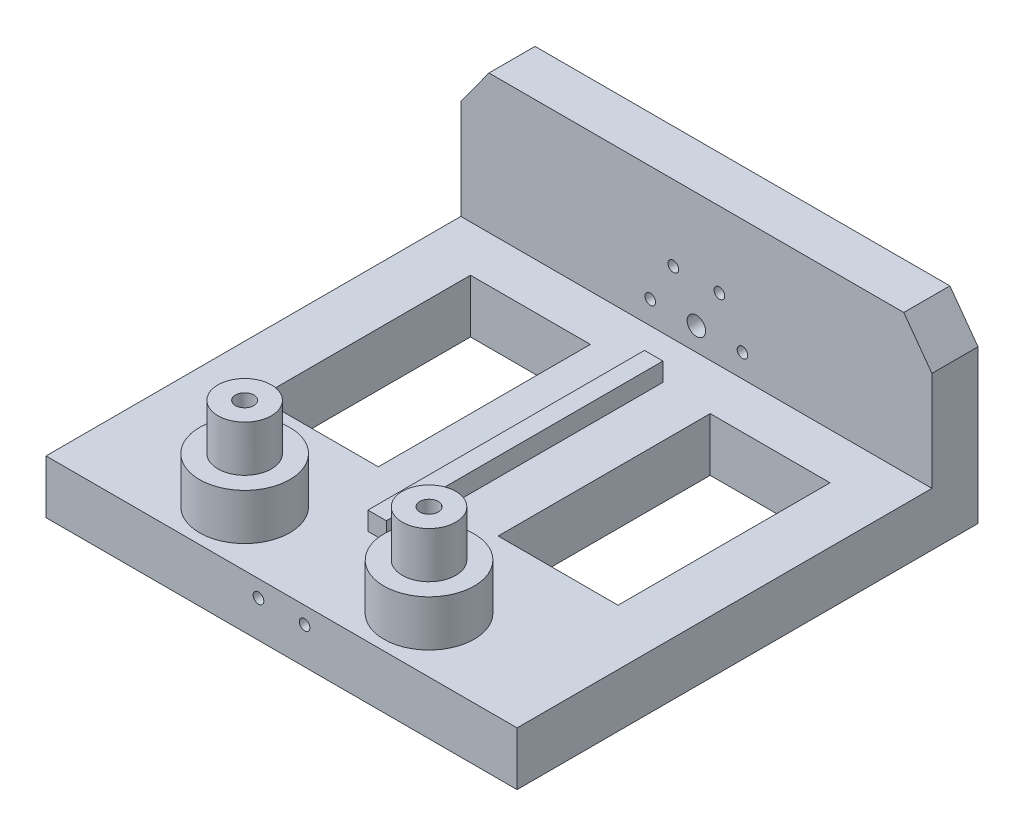
ISO-10303-21;
HEADER;
FILE_DESCRIPTION(('STEP AP214'),'2;1');
FILE_NAME('part.step','',(''),(''),'','','');
FILE_SCHEMA(('AUTOMOTIVE_DESIGN { 1 0 10303 214 1 1 1 1 }'));
ENDSEC;
DATA;
#1=APPLICATION_CONTEXT('core data for automotive mechanical design processes');
#2=APPLICATION_PROTOCOL_DEFINITION('international standard','automotive_design',2000,#1);
#3=PRODUCT_CONTEXT('',#1,'mechanical');
#4=PRODUCT('Part','Part','',(#3));
#5=PRODUCT_RELATED_PRODUCT_CATEGORY('part','',(#4));
#6=PRODUCT_DEFINITION_FORMATION('','',#4);
#7=PRODUCT_DEFINITION_CONTEXT('part definition',#1,'design');
#8=PRODUCT_DEFINITION('design','',#6,#7);
#9=PRODUCT_DEFINITION_SHAPE('','',#8);
#10=(LENGTH_UNIT() NAMED_UNIT(*) SI_UNIT(.MILLI.,.METRE.));
#11=(NAMED_UNIT(*) PLANE_ANGLE_UNIT() SI_UNIT($,.RADIAN.));
#12=(NAMED_UNIT(*) SI_UNIT($,.STERADIAN.) SOLID_ANGLE_UNIT());
#13=UNCERTAINTY_MEASURE_WITH_UNIT(LENGTH_MEASURE(1.E-05),#10,'distance_accuracy_value','');
#14=(GEOMETRIC_REPRESENTATION_CONTEXT(3) GLOBAL_UNCERTAINTY_ASSIGNED_CONTEXT((#13)) GLOBAL_UNIT_ASSIGNED_CONTEXT((#10,
#11,#12)) REPRESENTATION_CONTEXT('',''));
#15=CARTESIAN_POINT('',(0.,0.,0.));
#16=DIRECTION('',(0.,0.,1.));
#17=DIRECTION('',(1.,0.,0.));
#18=AXIS2_PLACEMENT_3D('',#15,#16,#17);
#19=CARTESIAN_POINT('',(0.,-2.5,50.));
#20=DIRECTION('',(0.,1.,0.));
#21=DIRECTION('',(0.,0.,1.));
#22=AXIS2_PLACEMENT_3D('',#19,#20,#21);
#23=PLANE('',#22);
#24=CARTESIAN_POINT('',(-9.99999999999999,-2.5,44.));
#25=DIRECTION('',(0.,1.,0.));
#26=DIRECTION('',(0.,0.,1.));
#27=AXIS2_PLACEMENT_3D('',#24,#25,#26);
#28=CIRCLE('',#27,4.9);
#29=CARTESIAN_POINT('',(-9.99999999999999,-2.5,48.9));
#30=VERTEX_POINT('',#29);
#31=EDGE_CURVE('E234',#30,#30,#28,.T.);
#32=ORIENTED_EDGE('',*,*,#31,.F.);
#33=EDGE_LOOP('',(#32));
#34=FACE_BOUND('',#33,.T.);
#35=DIRECTION('',(0.,0.,1.));
#36=VECTOR('',#35,1.);
#37=CARTESIAN_POINT('',(6.50000000000001,-2.5,33.));
#38=LINE('',#37,#36);
#39=CARTESIAN_POINT('',(6.50000000000001,-2.5,10.));
#40=VERTEX_POINT('',#39);
#41=CARTESIAN_POINT('',(6.50000000000001,-2.5,33.));
#42=VERTEX_POINT('',#41);
#43=EDGE_CURVE('E237',#40,#42,#38,.T.);
#44=ORIENTED_EDGE('',*,*,#43,.F.);
#45=DIRECTION('',(-1.,0.,0.));
#46=VECTOR('',#45,1.);
#47=CARTESIAN_POINT('',(19.5,-2.5,10.));
#48=LINE('',#47,#46);
#49=CARTESIAN_POINT('',(19.5,-2.5,10.));
#50=VERTEX_POINT('',#49);
#51=EDGE_CURVE('E247',#50,#40,#48,.T.);
#52=ORIENTED_EDGE('',*,*,#51,.F.);
#53=DIRECTION('',(0.,0.,-1.));
#54=VECTOR('',#53,1.);
#55=CARTESIAN_POINT('',(19.5,-2.5,33.));
#56=LINE('',#55,#54);
#57=CARTESIAN_POINT('',(19.5,-2.5,33.));
#58=VERTEX_POINT('',#57);
#59=EDGE_CURVE('E244',#58,#50,#56,.T.);
#60=ORIENTED_EDGE('',*,*,#59,.F.);
#61=DIRECTION('',(1.,0.,0.));
#62=VECTOR('',#61,1.);
#63=CARTESIAN_POINT('',(19.5,-2.5,33.));
#64=LINE('',#63,#62);
#65=EDGE_CURVE('E240',#42,#58,#64,.T.);
#66=ORIENTED_EDGE('',*,*,#65,.F.);
#67=EDGE_LOOP('',(#44,#52,#60,#66));
#68=FACE_BOUND('',#67,.T.);
#69=DIRECTION('',(0.,0.,1.));
#70=VECTOR('',#69,1.);
#71=CARTESIAN_POINT('',(-19.5,-2.5,33.));
#72=LINE('',#71,#70);
#73=CARTESIAN_POINT('',(-19.5,-2.5,10.));
#74=VERTEX_POINT('',#73);
#75=CARTESIAN_POINT('',(-19.5,-2.5,33.));
#76=VERTEX_POINT('',#75);
#77=EDGE_CURVE('E231',#74,#76,#72,.T.);
#78=ORIENTED_EDGE('',*,*,#77,.F.);
#79=DIRECTION('',(-1.,0.,0.));
#80=VECTOR('',#79,1.);
#81=CARTESIAN_POINT('',(-19.5,-2.5,10.));
#82=LINE('',#81,#80);
#83=CARTESIAN_POINT('',(-6.50000000000001,-2.5,10.));
#84=VERTEX_POINT('',#83);
#85=EDGE_CURVE('E267',#84,#74,#82,.T.);
#86=ORIENTED_EDGE('',*,*,#85,.F.);
#87=DIRECTION('',(0.,0.,-1.));
#88=VECTOR('',#87,1.);
#89=CARTESIAN_POINT('',(-6.50000000000001,-2.5,33.));
#90=LINE('',#89,#88);
#91=CARTESIAN_POINT('',(-6.50000000000001,-2.5,33.));
#92=VERTEX_POINT('',#91);
#93=EDGE_CURVE('E264',#92,#84,#90,.T.);
#94=ORIENTED_EDGE('',*,*,#93,.F.);
#95=DIRECTION('',(1.,0.,0.));
#96=VECTOR('',#95,1.);
#97=CARTESIAN_POINT('',(-19.5,-2.5,33.));
#98=LINE('',#97,#96);
#99=EDGE_CURVE('E261',#76,#92,#98,.T.);
#100=ORIENTED_EDGE('',*,*,#99,.F.);
#101=EDGE_LOOP('',(#78,#86,#94,#100));
#102=FACE_BOUND('',#101,.T.);
#103=DIRECTION('',(1.,0.,0.));
#104=VECTOR('',#103,1.);
#105=CARTESIAN_POINT('',(0.,-2.5,5.));
#106=LINE('',#105,#104);
#107=CARTESIAN_POINT('',(-25.5501980270922,-2.5,5.));
#108=VERTEX_POINT('',#107);
#109=CARTESIAN_POINT('',(25.5501980270922,-2.5,5.));
#110=VERTEX_POINT('',#109);
#111=EDGE_CURVE('E305',#108,#110,#106,.T.);
#112=ORIENTED_EDGE('',*,*,#111,.F.);
#113=DIRECTION('',(0.,0.,-1.));
#114=VECTOR('',#113,1.);
#115=CARTESIAN_POINT('',(-25.5501980270922,-2.5,50.));
#116=LINE('',#115,#114);
#117=CARTESIAN_POINT('',(-25.5501980270922,-2.5,50.));
#118=VERTEX_POINT('',#117);
#119=EDGE_CURVE('E323',#118,#108,#116,.T.);
#120=ORIENTED_EDGE('',*,*,#119,.F.);
#121=DIRECTION('',(1.,0.,0.));
#122=VECTOR('',#121,1.);
#123=CARTESIAN_POINT('',(0.,-2.5,50.));
#124=LINE('',#123,#122);
#125=CARTESIAN_POINT('',(25.5501980270922,-2.5,50.));
#126=VERTEX_POINT('',#125);
#127=EDGE_CURVE('E306',#118,#126,#124,.T.);
#128=ORIENTED_EDGE('',*,*,#127,.T.);
#129=DIRECTION('',(0.,0.,-1.));
#130=VECTOR('',#129,1.);
#131=CARTESIAN_POINT('',(25.5501980270922,-2.5,50.));
#132=LINE('',#131,#130);
#133=EDGE_CURVE('E319',#126,#110,#132,.T.);
#134=ORIENTED_EDGE('',*,*,#133,.T.);
#135=EDGE_LOOP('',(#112,#120,#128,#134));
#136=FACE_BOUND('',#135,.T.);
#137=DIRECTION('',(1.,0.,0.));
#138=VECTOR('',#137,1.);
#139=CARTESIAN_POINT('',(1.00000000000001,-2.5,39.6289253842812));
#140=LINE('',#139,#138);
#141=CARTESIAN_POINT('',(-0.999999999999991,-2.5,39.6289253842812));
#142=VERTEX_POINT('',#141);
#143=CARTESIAN_POINT('',(1.00000000000001,-2.5,39.6289253842812));
#144=VERTEX_POINT('',#143);
#145=EDGE_CURVE('E290',#142,#144,#140,.T.);
#146=ORIENTED_EDGE('',*,*,#145,.F.);
#147=DIRECTION('',(0.,0.,1.));
#148=VECTOR('',#147,1.);
#149=CARTESIAN_POINT('',(-1.,-2.5,9.62892538428119));
#150=LINE('',#149,#148);
#151=CARTESIAN_POINT('',(-1.,-2.5,9.62892538428119));
#152=VERTEX_POINT('',#151);
#153=EDGE_CURVE('E253',#152,#142,#150,.T.);
#154=ORIENTED_EDGE('',*,*,#153,.F.);
#155=DIRECTION('',(-1.,0.,0.));
#156=VECTOR('',#155,1.);
#157=CARTESIAN_POINT('',(1.,-2.5,9.62892538428119));
#158=LINE('',#157,#156);
#159=CARTESIAN_POINT('',(1.,-2.5,9.62892538428119));
#160=VERTEX_POINT('',#159);
#161=EDGE_CURVE('E281',#160,#152,#158,.T.);
#162=ORIENTED_EDGE('',*,*,#161,.F.);
#163=DIRECTION('',(0.,0.,-1.));
#164=VECTOR('',#163,1.);
#165=CARTESIAN_POINT('',(1.,-2.5,9.62892538428119));
#166=LINE('',#165,#164);
#167=EDGE_CURVE('E292',#144,#160,#166,.T.);
#168=ORIENTED_EDGE('',*,*,#167,.F.);
#169=EDGE_LOOP('',(#146,#154,#162,#168));
#170=FACE_BOUND('',#169,.T.);
#171=CARTESIAN_POINT('',(10.,-2.5,44.));
#172=DIRECTION('',(0.,1.,0.));
#173=DIRECTION('',(0.,0.,1.));
#174=AXIS2_PLACEMENT_3D('',#171,#172,#173);
#175=CIRCLE('',#174,4.9);
#176=CARTESIAN_POINT('',(10.,-2.5,48.9));
#177=VERTEX_POINT('',#176);
#178=EDGE_CURVE('E400',#177,#177,#175,.T.);
#179=ORIENTED_EDGE('',*,*,#178,.F.);
#180=EDGE_LOOP('',(#179));
#181=FACE_BOUND('',#180,.T.);
#182=ADVANCED_FACE('F35',(#34,#68,#102,#136,#170,#181),#23,.T.);
#183=CARTESIAN_POINT('',(0.,0.,5.));
#184=DIRECTION('',(0.,0.,1.));
#185=DIRECTION('',(1.,0.,0.));
#186=AXIS2_PLACEMENT_3D('',#183,#184,#185);
#187=PLANE('',#186);
#188=CARTESIAN_POINT('',(5.,0.,5.));
#189=DIRECTION('',(0.,0.,1.));
#190=DIRECTION('',(1.,0.,0.));
#191=AXIS2_PLACEMENT_3D('',#188,#189,#190);
#192=CIRCLE('',#191,0.575);
#193=CARTESIAN_POINT('',(5.575,0.,5.));
#194=VERTEX_POINT('',#193);
#195=EDGE_CURVE('E332',#194,#194,#192,.T.);
#196=ORIENTED_EDGE('',*,*,#195,.F.);
#197=EDGE_LOOP('',(#196));
#198=FACE_BOUND('',#197,.T.);
#199=CARTESIAN_POINT('',(-2.49999999999999,4.3301270189222,5.));
#200=DIRECTION('',(0.,0.,1.));
#201=DIRECTION('',(1.,0.,0.));
#202=AXIS2_PLACEMENT_3D('',#199,#200,#201);
#203=CIRCLE('',#202,0.575);
#204=CARTESIAN_POINT('',(-1.92499999999999,4.3301270189222,5.));
#205=VERTEX_POINT('',#204);
#206=EDGE_CURVE('E344',#205,#205,#203,.T.);
#207=ORIENTED_EDGE('',*,*,#206,.F.);
#208=EDGE_LOOP('',(#207));
#209=FACE_BOUND('',#208,.T.);
#210=CARTESIAN_POINT('',(0.,0.,5.));
#211=DIRECTION('',(0.,0.,1.));
#212=DIRECTION('',(1.,0.,0.));
#213=AXIS2_PLACEMENT_3D('',#210,#211,#212);
#214=CIRCLE('',#213,1.);
#215=CARTESIAN_POINT('',(1.,0.,5.));
#216=VERTEX_POINT('',#215);
#217=EDGE_CURVE('E356',#216,#216,#214,.T.);
#218=ORIENTED_EDGE('',*,*,#217,.F.);
#219=EDGE_LOOP('',(#218));
#220=FACE_BOUND('',#219,.T.);
#221=CARTESIAN_POINT('',(-5.,0.,5.));
#222=DIRECTION('',(0.,0.,1.));
#223=DIRECTION('',(1.,0.,0.));
#224=AXIS2_PLACEMENT_3D('',#221,#222,#223);
#225=CIRCLE('',#224,0.575);
#226=CARTESIAN_POINT('',(-4.425,0.,5.));
#227=VERTEX_POINT('',#226);
#228=EDGE_CURVE('E350',#227,#227,#225,.T.);
#229=ORIENTED_EDGE('',*,*,#228,.F.);
#230=EDGE_LOOP('',(#229));
#231=FACE_BOUND('',#230,.T.);
#232=CARTESIAN_POINT('',(2.50000000000002,4.33012701892218,5.));
#233=DIRECTION('',(0.,0.,1.));
#234=DIRECTION('',(1.,0.,0.));
#235=AXIS2_PLACEMENT_3D('',#232,#233,#234);
#236=CIRCLE('',#235,0.575);
#237=CARTESIAN_POINT('',(3.07500000000002,4.33012701892218,5.));
#238=VERTEX_POINT('',#237);
#239=EDGE_CURVE('E338',#238,#238,#236,.T.);
#240=ORIENTED_EDGE('',*,*,#239,.F.);
#241=EDGE_LOOP('',(#240));
#242=FACE_BOUND('',#241,.T.);
#243=DIRECTION('',(0.,-1.,0.));
#244=VECTOR('',#243,1.);
#245=CARTESIAN_POINT('',(-25.5501980270922,8.30176258165341,5.));
#246=LINE('',#245,#244);
#247=CARTESIAN_POINT('',(-25.5501980270922,8.30176258165341,5.));
#248=VERTEX_POINT('',#247);
#249=EDGE_CURVE('E363',#248,#108,#246,.T.);
#250=ORIENTED_EDGE('',*,*,#249,.T.);
#251=ORIENTED_EDGE('',*,*,#111,.T.);
#252=DIRECTION('',(0.,1.,0.));
#253=VECTOR('',#252,1.);
#254=CARTESIAN_POINT('',(25.5501980270922,-8.30176258165341,5.));
#255=LINE('',#254,#253);
#256=CARTESIAN_POINT('',(25.5501980270922,8.30176258165341,5.));
#257=VERTEX_POINT('',#256);
#258=EDGE_CURVE('E366',#110,#257,#255,.T.);
#259=ORIENTED_EDGE('',*,*,#258,.T.);
#260=DIRECTION('',(-0.587785252292473,0.809016994374947,0.));
#261=VECTOR('',#260,1.);
#262=CARTESIAN_POINT('',(25.5501980270922,8.30176258165341,5.));
#263=LINE('',#262,#261);
#264=CARTESIAN_POINT('',(22.5,12.5,5.));
#265=VERTEX_POINT('',#264);
#266=EDGE_CURVE('E368',#257,#265,#263,.T.);
#267=ORIENTED_EDGE('',*,*,#266,.T.);
#268=DIRECTION('',(-1.,0.,0.));
#269=VECTOR('',#268,1.);
#270=CARTESIAN_POINT('',(-22.5,12.5,5.));
#271=LINE('',#270,#269);
#272=CARTESIAN_POINT('',(-22.5,12.5,5.));
#273=VERTEX_POINT('',#272);
#274=EDGE_CURVE('E212',#265,#273,#271,.T.);
#275=ORIENTED_EDGE('',*,*,#274,.T.);
#276=DIRECTION('',(-0.587785252292473,-0.809016994374947,0.));
#277=VECTOR('',#276,1.);
#278=CARTESIAN_POINT('',(-22.5,12.5,5.));
#279=LINE('',#278,#277);
#280=EDGE_CURVE('E207',#273,#248,#279,.T.);
#281=ORIENTED_EDGE('',*,*,#280,.T.);
#282=EDGE_LOOP('',(#250,#251,#259,#267,#275,#281));
#283=FACE_BOUND('',#282,.T.);
#284=ADVANCED_FACE('F381',(#198,#209,#220,#231,#242,#283),#187,.T.);
#285=CARTESIAN_POINT('',(0.,0.,0.));
#286=DIRECTION('',(0.,0.,1.));
#287=DIRECTION('',(1.,0.,0.));
#288=AXIS2_PLACEMENT_3D('',#285,#286,#287);
#289=PLANE('',#288);
#290=DIRECTION('',(0.,1.,0.));
#291=VECTOR('',#290,1.);
#292=CARTESIAN_POINT('',(25.5501980270922,-8.30176258165341,0.));
#293=LINE('',#292,#291);
#294=CARTESIAN_POINT('',(25.5501980270922,-8.30176258165341,0.));
#295=VERTEX_POINT('',#294);
#296=CARTESIAN_POINT('',(25.5501980270922,8.30176258165341,0.));
#297=VERTEX_POINT('',#296);
#298=EDGE_CURVE('E187',#295,#297,#293,.T.);
#299=ORIENTED_EDGE('',*,*,#298,.F.);
#300=DIRECTION('',(-1.,0.,0.));
#301=VECTOR('',#300,1.);
#302=CARTESIAN_POINT('',(25.5501980270922,-8.30176258165341,0.));
#303=LINE('',#302,#301);
#304=CARTESIAN_POINT('',(-25.5501980270922,-8.30176258165341,0.));
#305=VERTEX_POINT('',#304);
#306=EDGE_CURVE('E173',#295,#305,#303,.T.);
#307=ORIENTED_EDGE('',*,*,#306,.T.);
#308=DIRECTION('',(0.,-1.,0.));
#309=VECTOR('',#308,1.);
#310=CARTESIAN_POINT('',(-25.5501980270922,8.30176258165341,0.));
#311=LINE('',#310,#309);
#312=CARTESIAN_POINT('',(-25.5501980270922,8.30176258165341,0.));
#313=VERTEX_POINT('',#312);
#314=EDGE_CURVE('E198',#313,#305,#311,.T.);
#315=ORIENTED_EDGE('',*,*,#314,.F.);
#316=DIRECTION('',(-0.587785252292473,-0.809016994374947,0.));
#317=VECTOR('',#316,1.);
#318=CARTESIAN_POINT('',(-22.5,12.5,0.));
#319=LINE('',#318,#317);
#320=CARTESIAN_POINT('',(-22.5,12.5,0.));
#321=VERTEX_POINT('',#320);
#322=EDGE_CURVE('E202',#321,#313,#319,.T.);
#323=ORIENTED_EDGE('',*,*,#322,.F.);
#324=DIRECTION('',(-1.,0.,0.));
#325=VECTOR('',#324,1.);
#326=CARTESIAN_POINT('',(-22.5,12.5,0.));
#327=LINE('',#326,#325);
#328=CARTESIAN_POINT('',(22.5,12.5,0.));
#329=VERTEX_POINT('',#328);
#330=EDGE_CURVE('E200',#329,#321,#327,.T.);
#331=ORIENTED_EDGE('',*,*,#330,.F.);
#332=DIRECTION('',(-0.587785252292473,0.809016994374947,0.));
#333=VECTOR('',#332,1.);
#334=CARTESIAN_POINT('',(25.5501980270922,8.30176258165341,0.));
#335=LINE('',#334,#333);
#336=EDGE_CURVE('E197',#297,#329,#335,.T.);
#337=ORIENTED_EDGE('',*,*,#336,.F.);
#338=EDGE_LOOP('',(#299,#307,#315,#323,#331,#337));
#339=FACE_BOUND('',#338,.T.);
#340=CARTESIAN_POINT('',(0.,0.,0.));
#341=DIRECTION('',(0.,0.,1.));
#342=DIRECTION('',(1.,0.,0.));
#343=AXIS2_PLACEMENT_3D('',#340,#341,#342);
#344=CIRCLE('',#343,1.);
#345=CARTESIAN_POINT('',(1.,0.,0.));
#346=VERTEX_POINT('',#345);
#347=EDGE_CURVE('E353',#346,#346,#344,.T.);
#348=ORIENTED_EDGE('',*,*,#347,.T.);
#349=EDGE_LOOP('',(#348));
#350=FACE_BOUND('',#349,.T.);
#351=CARTESIAN_POINT('',(-5.,0.,0.));
#352=DIRECTION('',(0.,0.,1.));
#353=DIRECTION('',(1.,0.,0.));
#354=AXIS2_PLACEMENT_3D('',#351,#352,#353);
#355=CIRCLE('',#354,0.575);
#356=CARTESIAN_POINT('',(-4.425,0.,0.));
#357=VERTEX_POINT('',#356);
#358=EDGE_CURVE('E347',#357,#357,#355,.T.);
#359=ORIENTED_EDGE('',*,*,#358,.T.);
#360=EDGE_LOOP('',(#359));
#361=FACE_BOUND('',#360,.T.);
#362=CARTESIAN_POINT('',(-2.49999999999999,4.3301270189222,0.));
#363=DIRECTION('',(0.,0.,1.));
#364=DIRECTION('',(1.,0.,0.));
#365=AXIS2_PLACEMENT_3D('',#362,#363,#364);
#366=CIRCLE('',#365,0.575);
#367=CARTESIAN_POINT('',(-1.92499999999999,4.3301270189222,0.));
#368=VERTEX_POINT('',#367);
#369=EDGE_CURVE('E341',#368,#368,#366,.T.);
#370=ORIENTED_EDGE('',*,*,#369,.T.);
#371=EDGE_LOOP('',(#370));
#372=FACE_BOUND('',#371,.T.);
#373=CARTESIAN_POINT('',(2.50000000000002,4.33012701892218,0.));
#374=DIRECTION('',(0.,0.,1.));
#375=DIRECTION('',(1.,0.,0.));
#376=AXIS2_PLACEMENT_3D('',#373,#374,#375);
#377=CIRCLE('',#376,0.575);
#378=CARTESIAN_POINT('',(3.07500000000002,4.33012701892218,0.));
#379=VERTEX_POINT('',#378);
#380=EDGE_CURVE('E335',#379,#379,#377,.T.);
#381=ORIENTED_EDGE('',*,*,#380,.T.);
#382=EDGE_LOOP('',(#381));
#383=FACE_BOUND('',#382,.T.);
#384=CARTESIAN_POINT('',(5.,0.,0.));
#385=DIRECTION('',(0.,0.,1.));
#386=DIRECTION('',(1.,0.,0.));
#387=AXIS2_PLACEMENT_3D('',#384,#385,#386);
#388=CIRCLE('',#387,0.575);
#389=CARTESIAN_POINT('',(5.575,0.,0.));
#390=VERTEX_POINT('',#389);
#391=EDGE_CURVE('E331',#390,#390,#388,.T.);
#392=ORIENTED_EDGE('',*,*,#391,.T.);
#393=EDGE_LOOP('',(#392));
#394=FACE_BOUND('',#393,.T.);
#395=CARTESIAN_POINT('',(2.49999999999996,-4.33012701892221,0.));
#396=DIRECTION('',(0.,0.,1.));
#397=DIRECTION('',(1.,0.,0.));
#398=AXIS2_PLACEMENT_3D('',#395,#396,#397);
#399=CIRCLE('',#398,0.575);
#400=CARTESIAN_POINT('',(3.07499999999996,-4.33012701892221,0.));
#401=VERTEX_POINT('',#400);
#402=EDGE_CURVE('E328',#401,#401,#399,.T.);
#403=ORIENTED_EDGE('',*,*,#402,.T.);
#404=EDGE_LOOP('',(#403));
#405=FACE_BOUND('',#404,.T.);
#406=CARTESIAN_POINT('',(-2.50000000000005,-4.33012701892216,0.));
#407=DIRECTION('',(0.,0.,1.));
#408=DIRECTION('',(1.,0.,0.));
#409=AXIS2_PLACEMENT_3D('',#406,#407,#408);
#410=CIRCLE('',#409,0.575000000000001);
#411=CARTESIAN_POINT('',(-1.92500000000005,-4.33012701892216,0.));
#412=VERTEX_POINT('',#411);
#413=EDGE_CURVE('E325',#412,#412,#410,.T.);
#414=ORIENTED_EDGE('',*,*,#413,.T.);
#415=EDGE_LOOP('',(#414));
#416=FACE_BOUND('',#415,.T.);
#417=ADVANCED_FACE('F194',(#339,#350,#361,#372,#383,#394,#405,#416),#289,.F.);
#418=CARTESIAN_POINT('',(-22.5,12.5,5.));
#419=DIRECTION('',(0.809016994374947,-0.587785252292473,0.));
#420=DIRECTION('',(0.587785252292473,0.809016994374947,0.));
#421=AXIS2_PLACEMENT_3D('',#418,#419,#420);
#422=PLANE('',#421);
#423=ORIENTED_EDGE('',*,*,#322,.T.);
#424=DIRECTION('',(0.,0.,-1.));
#425=VECTOR('',#424,1.);
#426=CARTESIAN_POINT('',(-25.5501980270922,8.30176258165341,5.));
#427=LINE('',#426,#425);
#428=EDGE_CURVE('E11',#248,#313,#427,.T.);
#429=ORIENTED_EDGE('',*,*,#428,.F.);
#430=ORIENTED_EDGE('',*,*,#280,.F.);
#431=DIRECTION('',(0.,0.,-1.));
#432=VECTOR('',#431,1.);
#433=CARTESIAN_POINT('',(-22.5,12.5,5.));
#434=LINE('',#433,#432);
#435=EDGE_CURVE('E208',#273,#321,#434,.T.);
#436=ORIENTED_EDGE('',*,*,#435,.T.);
#437=EDGE_LOOP('',(#423,#429,#430,#436));
#438=FACE_BOUND('',#437,.T.);
#439=ADVANCED_FACE('F37',(#438),#422,.F.);
#440=CARTESIAN_POINT('',(-25.5501980270922,8.30176258165341,5.));
#441=DIRECTION('',(1.,0.,0.));
#442=DIRECTION('',(0.,0.,-1.));
#443=AXIS2_PLACEMENT_3D('',#440,#441,#442);
#444=PLANE('',#443);
#445=ORIENTED_EDGE('',*,*,#314,.T.);
#446=DIRECTION('',(0.,0.,-1.));
#447=VECTOR('',#446,1.);
#448=CARTESIAN_POINT('',(-25.5501980270922,-8.30176258165341,5.));
#449=LINE('',#448,#447);
#450=CARTESIAN_POINT('',(-25.5501980270922,-8.30176258165341,50.));
#451=VERTEX_POINT('',#450);
#452=EDGE_CURVE('E44',#451,#305,#449,.T.);
#453=ORIENTED_EDGE('',*,*,#452,.F.);
#454=DIRECTION('',(0.,-1.,0.));
#455=VECTOR('',#454,1.);
#456=CARTESIAN_POINT('',(-25.5501980270922,0.,50.));
#457=LINE('',#456,#455);
#458=EDGE_CURVE('E309',#118,#451,#457,.T.);
#459=ORIENTED_EDGE('',*,*,#458,.F.);
#460=ORIENTED_EDGE('',*,*,#119,.T.);
#461=ORIENTED_EDGE('',*,*,#249,.F.);
#462=ORIENTED_EDGE('',*,*,#428,.T.);
#463=EDGE_LOOP('',(#445,#453,#459,#460,#461,#462));
#464=FACE_BOUND('',#463,.T.);
#465=ADVANCED_FACE('F377',(#464),#444,.F.);
#466=CARTESIAN_POINT('',(25.5501980270922,-8.30176258165341,5.));
#467=DIRECTION('',(-1.,0.,0.));
#468=DIRECTION('',(0.,0.,1.));
#469=AXIS2_PLACEMENT_3D('',#466,#467,#468);
#470=PLANE('',#469);
#471=ORIENTED_EDGE('',*,*,#298,.T.);
#472=DIRECTION('',(0.,0.,-1.));
#473=VECTOR('',#472,1.);
#474=CARTESIAN_POINT('',(25.5501980270922,8.30176258165341,5.));
#475=LINE('',#474,#473);
#476=EDGE_CURVE('E191',#257,#297,#475,.T.);
#477=ORIENTED_EDGE('',*,*,#476,.F.);
#478=ORIENTED_EDGE('',*,*,#258,.F.);
#479=ORIENTED_EDGE('',*,*,#133,.F.);
#480=DIRECTION('',(0.,1.,0.));
#481=VECTOR('',#480,1.);
#482=CARTESIAN_POINT('',(25.5501980270922,0.,50.));
#483=LINE('',#482,#481);
#484=CARTESIAN_POINT('',(25.5501980270922,-8.30176258165341,50.));
#485=VERTEX_POINT('',#484);
#486=EDGE_CURVE('E190',#485,#126,#483,.T.);
#487=ORIENTED_EDGE('',*,*,#486,.F.);
#488=DIRECTION('',(0.,0.,-1.));
#489=VECTOR('',#488,1.);
#490=CARTESIAN_POINT('',(25.5501980270922,-8.30176258165341,5.));
#491=LINE('',#490,#489);
#492=EDGE_CURVE('E176',#485,#295,#491,.T.);
#493=ORIENTED_EDGE('',*,*,#492,.T.);
#494=EDGE_LOOP('',(#471,#477,#478,#479,#487,#493));
#495=FACE_BOUND('',#494,.T.);
#496=ADVANCED_FACE('F185',(#495),#470,.F.);
#497=CARTESIAN_POINT('',(25.5501980270922,8.30176258165341,5.));
#498=DIRECTION('',(-0.809016994374947,-0.587785252292473,0.));
#499=DIRECTION('',(0.587785252292473,-0.809016994374948,0.));
#500=AXIS2_PLACEMENT_3D('',#497,#498,#499);
#501=PLANE('',#500);
#502=ORIENTED_EDGE('',*,*,#336,.T.);
#503=DIRECTION('',(0.,0.,-1.));
#504=VECTOR('',#503,1.);
#505=CARTESIAN_POINT('',(22.5,12.5,5.));
#506=LINE('',#505,#504);
#507=EDGE_CURVE('E211',#265,#329,#506,.T.);
#508=ORIENTED_EDGE('',*,*,#507,.F.);
#509=ORIENTED_EDGE('',*,*,#266,.F.);
#510=ORIENTED_EDGE('',*,*,#476,.T.);
#511=EDGE_LOOP('',(#502,#508,#509,#510));
#512=FACE_BOUND('',#511,.T.);
#513=ADVANCED_FACE('F388',(#512),#501,.F.);
#514=CARTESIAN_POINT('',(-22.5,12.5,5.));
#515=DIRECTION('',(0.,-1.,0.));
#516=DIRECTION('',(0.,0.,-1.));
#517=AXIS2_PLACEMENT_3D('',#514,#515,#516);
#518=PLANE('',#517);
#519=ORIENTED_EDGE('',*,*,#330,.T.);
#520=ORIENTED_EDGE('',*,*,#435,.F.);
#521=ORIENTED_EDGE('',*,*,#274,.F.);
#522=ORIENTED_EDGE('',*,*,#507,.T.);
#523=EDGE_LOOP('',(#519,#520,#521,#522));
#524=FACE_BOUND('',#523,.T.);
#525=ADVANCED_FACE('F386',(#524),#518,.F.);
#526=CARTESIAN_POINT('',(0.,0.,5.));
#527=DIRECTION('',(0.,0.,-1.));
#528=DIRECTION('',(-1.,0.,0.));
#529=AXIS2_PLACEMENT_3D('',#526,#527,#528);
#530=CYLINDRICAL_SURFACE('',#529,1.);
#531=ORIENTED_EDGE('',*,*,#217,.T.);
#532=EDGE_LOOP('',(#531));
#533=FACE_BOUND('',#532,.T.);
#534=ORIENTED_EDGE('',*,*,#347,.F.);
#535=EDGE_LOOP('',(#534));
#536=FACE_BOUND('',#535,.T.);
#537=ADVANCED_FACE('F548',(#533,#536),#530,.F.);
#538=CARTESIAN_POINT('',(-5.,0.,5.));
#539=DIRECTION('',(0.,0.,-1.));
#540=DIRECTION('',(-1.,0.,0.));
#541=AXIS2_PLACEMENT_3D('',#538,#539,#540);
#542=CYLINDRICAL_SURFACE('',#541,0.575);
#543=ORIENTED_EDGE('',*,*,#228,.T.);
#544=EDGE_LOOP('',(#543));
#545=FACE_BOUND('',#544,.T.);
#546=ORIENTED_EDGE('',*,*,#358,.F.);
#547=EDGE_LOOP('',(#546));
#548=FACE_BOUND('',#547,.T.);
#549=ADVANCED_FACE('F544',(#545,#548),#542,.F.);
#550=CARTESIAN_POINT('',(-2.49999999999999,4.3301270189222,5.));
#551=DIRECTION('',(0.,0.,-1.));
#552=DIRECTION('',(-1.,0.,0.));
#553=AXIS2_PLACEMENT_3D('',#550,#551,#552);
#554=CYLINDRICAL_SURFACE('',#553,0.575);
#555=ORIENTED_EDGE('',*,*,#206,.T.);
#556=EDGE_LOOP('',(#555));
#557=FACE_BOUND('',#556,.T.);
#558=ORIENTED_EDGE('',*,*,#369,.F.);
#559=EDGE_LOOP('',(#558));
#560=FACE_BOUND('',#559,.T.);
#561=ADVANCED_FACE('F540',(#557,#560),#554,.F.);
#562=CARTESIAN_POINT('',(2.50000000000002,4.33012701892218,5.));
#563=DIRECTION('',(0.,0.,-1.));
#564=DIRECTION('',(-1.,0.,0.));
#565=AXIS2_PLACEMENT_3D('',#562,#563,#564);
#566=CYLINDRICAL_SURFACE('',#565,0.575);
#567=ORIENTED_EDGE('',*,*,#239,.T.);
#568=EDGE_LOOP('',(#567));
#569=FACE_BOUND('',#568,.T.);
#570=ORIENTED_EDGE('',*,*,#380,.F.);
#571=EDGE_LOOP('',(#570));
#572=FACE_BOUND('',#571,.T.);
#573=ADVANCED_FACE('F536',(#569,#572),#566,.F.);
#574=CARTESIAN_POINT('',(5.,0.,5.));
#575=DIRECTION('',(0.,0.,-1.));
#576=DIRECTION('',(-1.,0.,0.));
#577=AXIS2_PLACEMENT_3D('',#574,#575,#576);
#578=CYLINDRICAL_SURFACE('',#577,0.575);
#579=ORIENTED_EDGE('',*,*,#195,.T.);
#580=EDGE_LOOP('',(#579));
#581=FACE_BOUND('',#580,.T.);
#582=ORIENTED_EDGE('',*,*,#391,.F.);
#583=EDGE_LOOP('',(#582));
#584=FACE_BOUND('',#583,.T.);
#585=ADVANCED_FACE('F532',(#581,#584),#578,.F.);
#586=CARTESIAN_POINT('',(2.49999999999996,-4.33012701892221,5.));
#587=DIRECTION('',(0.,0.,-1.));
#588=DIRECTION('',(-1.,0.,0.));
#589=AXIS2_PLACEMENT_3D('',#586,#587,#588);
#590=CYLINDRICAL_SURFACE('',#589,0.575);
#591=ORIENTED_EDGE('',*,*,#402,.F.);
#592=EDGE_LOOP('',(#591));
#593=FACE_BOUND('',#592,.T.);
#594=CARTESIAN_POINT('',(2.49999999999996,-4.33012701892221,50.));
#595=DIRECTION('',(0.,0.,1.));
#596=DIRECTION('',(1.,0.,0.));
#597=AXIS2_PLACEMENT_3D('',#594,#595,#596);
#598=CIRCLE('',#597,0.575);
#599=CARTESIAN_POINT('',(3.07499999999996,-4.33012701892221,50.));
#600=VERTEX_POINT('',#599);
#601=EDGE_CURVE('E316',#600,#600,#598,.F.);
#602=ORIENTED_EDGE('',*,*,#601,.F.);
#603=EDGE_LOOP('',(#602));
#604=FACE_BOUND('',#603,.T.);
#605=ADVANCED_FACE('F528',(#593,#604),#590,.F.);
#606=CARTESIAN_POINT('',(-2.50000000000005,-4.33012701892216,5.));
#607=DIRECTION('',(0.,0.,-1.));
#608=DIRECTION('',(-1.,0.,0.));
#609=AXIS2_PLACEMENT_3D('',#606,#607,#608);
#610=CYLINDRICAL_SURFACE('',#609,0.575000000000001);
#611=ORIENTED_EDGE('',*,*,#413,.F.);
#612=EDGE_LOOP('',(#611));
#613=FACE_BOUND('',#612,.T.);
#614=CARTESIAN_POINT('',(-2.50000000000005,-4.33012701892216,50.));
#615=DIRECTION('',(0.,0.,1.));
#616=DIRECTION('',(1.,0.,0.));
#617=AXIS2_PLACEMENT_3D('',#614,#615,#616);
#618=CIRCLE('',#617,0.575000000000001);
#619=CARTESIAN_POINT('',(-1.92500000000005,-4.33012701892216,50.));
#620=VERTEX_POINT('',#619);
#621=EDGE_CURVE('E313',#620,#620,#618,.F.);
#622=ORIENTED_EDGE('',*,*,#621,.F.);
#623=EDGE_LOOP('',(#622));
#624=FACE_BOUND('',#623,.T.);
#625=ADVANCED_FACE('F524',(#613,#624),#610,.F.);
#626=CARTESIAN_POINT('',(0.,0.,50.));
#627=DIRECTION('',(0.,0.,1.));
#628=DIRECTION('',(1.,0.,0.));
#629=AXIS2_PLACEMENT_3D('',#626,#627,#628);
#630=PLANE('',#629);
#631=DIRECTION('',(-1.,0.,0.));
#632=VECTOR('',#631,1.);
#633=CARTESIAN_POINT('',(0.,-8.30176258165341,50.));
#634=LINE('',#633,#632);
#635=EDGE_CURVE('E396',#485,#451,#634,.T.);
#636=ORIENTED_EDGE('',*,*,#635,.F.);
#637=ORIENTED_EDGE('',*,*,#486,.T.);
#638=ORIENTED_EDGE('',*,*,#127,.F.);
#639=ORIENTED_EDGE('',*,*,#458,.T.);
#640=EDGE_LOOP('',(#636,#637,#638,#639));
#641=FACE_BOUND('',#640,.T.);
#642=ORIENTED_EDGE('',*,*,#621,.T.);
#643=EDGE_LOOP('',(#642));
#644=FACE_BOUND('',#643,.T.);
#645=ORIENTED_EDGE('',*,*,#601,.T.);
#646=EDGE_LOOP('',(#645));
#647=FACE_BOUND('',#646,.T.);
#648=ADVANCED_FACE('F394',(#641,#644,#647),#630,.T.);
#649=CARTESIAN_POINT('',(-1.,-0.5,9.62892538428119));
#650=DIRECTION('',(1.,0.,0.));
#651=DIRECTION('',(0.,0.,-1.));
#652=AXIS2_PLACEMENT_3D('',#649,#650,#651);
#653=PLANE('',#652);
#654=ORIENTED_EDGE('',*,*,#153,.T.);
#655=DIRECTION('',(0.,-1.,0.));
#656=VECTOR('',#655,1.);
#657=CARTESIAN_POINT('',(-0.999999999999991,-0.5,39.6289253842812));
#658=LINE('',#657,#656);
#659=CARTESIAN_POINT('',(-0.999999999999991,-0.5,39.6289253842812));
#660=VERTEX_POINT('',#659);
#661=EDGE_CURVE('E303',#660,#142,#658,.T.);
#662=ORIENTED_EDGE('',*,*,#661,.F.);
#663=DIRECTION('',(0.,0.,1.));
#664=VECTOR('',#663,1.);
#665=CARTESIAN_POINT('',(-1.,-0.5,9.62892538428119));
#666=LINE('',#665,#664);
#667=CARTESIAN_POINT('',(-1.,-0.5,9.62892538428119));
#668=VERTEX_POINT('',#667);
#669=EDGE_CURVE('E277',#668,#660,#666,.T.);
#670=ORIENTED_EDGE('',*,*,#669,.F.);
#671=DIRECTION('',(0.,-1.,0.));
#672=VECTOR('',#671,1.);
#673=CARTESIAN_POINT('',(-1.,-0.5,9.62892538428119));
#674=LINE('',#673,#672);
#675=EDGE_CURVE('E287',#668,#152,#674,.T.);
#676=ORIENTED_EDGE('',*,*,#675,.T.);
#677=EDGE_LOOP('',(#654,#662,#670,#676));
#678=FACE_BOUND('',#677,.T.);
#679=ADVANCED_FACE('F518',(#678),#653,.F.);
#680=CARTESIAN_POINT('',(1.00000000000001,-0.5,39.6289253842812));
#681=DIRECTION('',(0.,0.,-1.));
#682=DIRECTION('',(-1.,0.,0.));
#683=AXIS2_PLACEMENT_3D('',#680,#681,#682);
#684=PLANE('',#683);
#685=ORIENTED_EDGE('',*,*,#145,.T.);
#686=DIRECTION('',(0.,-1.,0.));
#687=VECTOR('',#686,1.);
#688=CARTESIAN_POINT('',(1.00000000000001,-0.5,39.6289253842812));
#689=LINE('',#688,#687);
#690=CARTESIAN_POINT('',(1.00000000000001,-0.5,39.6289253842812));
#691=VERTEX_POINT('',#690);
#692=EDGE_CURVE('E300',#691,#144,#689,.T.);
#693=ORIENTED_EDGE('',*,*,#692,.F.);
#694=DIRECTION('',(1.,0.,0.));
#695=VECTOR('',#694,1.);
#696=CARTESIAN_POINT('',(1.00000000000001,-0.5,39.6289253842812));
#697=LINE('',#696,#695);
#698=EDGE_CURVE('E280',#660,#691,#697,.T.);
#699=ORIENTED_EDGE('',*,*,#698,.F.);
#700=ORIENTED_EDGE('',*,*,#661,.T.);
#701=EDGE_LOOP('',(#685,#693,#699,#700));
#702=FACE_BOUND('',#701,.T.);
#703=ADVANCED_FACE('F514',(#702),#684,.F.);
#704=CARTESIAN_POINT('',(1.,-0.5,9.62892538428119));
#705=DIRECTION('',(-1.,0.,0.));
#706=DIRECTION('',(0.,0.,1.));
#707=AXIS2_PLACEMENT_3D('',#704,#705,#706);
#708=PLANE('',#707);
#709=ORIENTED_EDGE('',*,*,#167,.T.);
#710=DIRECTION('',(0.,-1.,0.));
#711=VECTOR('',#710,1.);
#712=CARTESIAN_POINT('',(1.,-0.5,9.62892538428119));
#713=LINE('',#712,#711);
#714=CARTESIAN_POINT('',(1.,-0.5,9.62892538428119));
#715=VERTEX_POINT('',#714);
#716=EDGE_CURVE('E298',#715,#160,#713,.T.);
#717=ORIENTED_EDGE('',*,*,#716,.F.);
#718=DIRECTION('',(0.,0.,-1.));
#719=VECTOR('',#718,1.);
#720=CARTESIAN_POINT('',(1.,-0.5,9.62892538428119));
#721=LINE('',#720,#719);
#722=EDGE_CURVE('E283',#691,#715,#721,.T.);
#723=ORIENTED_EDGE('',*,*,#722,.F.);
#724=ORIENTED_EDGE('',*,*,#692,.T.);
#725=EDGE_LOOP('',(#709,#717,#723,#724));
#726=FACE_BOUND('',#725,.T.);
#727=ADVANCED_FACE('F510',(#726),#708,.F.);
#728=CARTESIAN_POINT('',(1.,-0.5,9.62892538428119));
#729=DIRECTION('',(0.,0.,1.));
#730=DIRECTION('',(1.,0.,0.));
#731=AXIS2_PLACEMENT_3D('',#728,#729,#730);
#732=PLANE('',#731);
#733=ORIENTED_EDGE('',*,*,#161,.T.);
#734=ORIENTED_EDGE('',*,*,#675,.F.);
#735=DIRECTION('',(-1.,0.,0.));
#736=VECTOR('',#735,1.);
#737=CARTESIAN_POINT('',(1.,-0.5,9.62892538428119));
#738=LINE('',#737,#736);
#739=EDGE_CURVE('E285',#715,#668,#738,.T.);
#740=ORIENTED_EDGE('',*,*,#739,.F.);
#741=ORIENTED_EDGE('',*,*,#716,.T.);
#742=EDGE_LOOP('',(#733,#734,#740,#741));
#743=FACE_BOUND('',#742,.T.);
#744=ADVANCED_FACE('F506',(#743),#732,.F.);
#745=CARTESIAN_POINT('',(0.,-0.5,0.));
#746=DIRECTION('',(0.,-1.,0.));
#747=DIRECTION('',(0.,0.,-1.));
#748=AXIS2_PLACEMENT_3D('',#745,#746,#747);
#749=PLANE('',#748);
#750=ORIENTED_EDGE('',*,*,#669,.T.);
#751=ORIENTED_EDGE('',*,*,#698,.T.);
#752=ORIENTED_EDGE('',*,*,#722,.T.);
#753=ORIENTED_EDGE('',*,*,#739,.T.);
#754=EDGE_LOOP('',(#750,#751,#752,#753));
#755=FACE_BOUND('',#754,.T.);
#756=ADVANCED_FACE('F503',(#755),#749,.F.);
#757=CARTESIAN_POINT('',(-19.5,-18.5,33.));
#758=DIRECTION('',(-1.,0.,0.));
#759=DIRECTION('',(0.,0.,1.));
#760=AXIS2_PLACEMENT_3D('',#757,#758,#759);
#761=PLANE('',#760);
#762=DIRECTION('',(0.,1.,0.));
#763=VECTOR('',#762,1.);
#764=CARTESIAN_POINT('',(-19.5,-18.5,33.));
#765=LINE('',#764,#763);
#766=CARTESIAN_POINT('',(-19.5,-8.30176258165341,33.));
#767=VERTEX_POINT('',#766);
#768=EDGE_CURVE('E270',#767,#76,#765,.T.);
#769=ORIENTED_EDGE('',*,*,#768,.F.);
#770=DIRECTION('',(0.,0.,-1.));
#771=VECTOR('',#770,1.);
#772=CARTESIAN_POINT('',(-19.5,-8.30176258165341,33.));
#773=LINE('',#772,#771);
#774=CARTESIAN_POINT('',(-19.5,-8.30176258165341,10.));
#775=VERTEX_POINT('',#774);
#776=EDGE_CURVE('E52',#767,#775,#773,.T.);
#777=ORIENTED_EDGE('',*,*,#776,.T.);
#778=DIRECTION('',(0.,1.,0.));
#779=VECTOR('',#778,1.);
#780=CARTESIAN_POINT('',(-19.5,-18.5,10.));
#781=LINE('',#780,#779);
#782=EDGE_CURVE('E241',#775,#74,#781,.T.);
#783=ORIENTED_EDGE('',*,*,#782,.T.);
#784=ORIENTED_EDGE('',*,*,#77,.T.);
#785=EDGE_LOOP('',(#769,#777,#783,#784));
#786=FACE_BOUND('',#785,.T.);
#787=ADVANCED_FACE('F434',(#786),#761,.F.);
#788=CARTESIAN_POINT('',(-19.5,-18.5,10.));
#789=DIRECTION('',(0.,0.,-1.));
#790=DIRECTION('',(-1.,0.,0.));
#791=AXIS2_PLACEMENT_3D('',#788,#789,#790);
#792=PLANE('',#791);
#793=ORIENTED_EDGE('',*,*,#782,.F.);
#794=DIRECTION('',(1.,0.,0.));
#795=VECTOR('',#794,1.);
#796=CARTESIAN_POINT('',(-19.5,-8.30176258165341,10.));
#797=LINE('',#796,#795);
#798=CARTESIAN_POINT('',(-6.50000000000001,-8.30176258165341,10.));
#799=VERTEX_POINT('',#798);
#800=EDGE_CURVE('E402',#775,#799,#797,.T.);
#801=ORIENTED_EDGE('',*,*,#800,.T.);
#802=DIRECTION('',(0.,1.,0.));
#803=VECTOR('',#802,1.);
#804=CARTESIAN_POINT('',(-6.50000000000001,-18.5,10.));
#805=LINE('',#804,#803);
#806=EDGE_CURVE('E272',#799,#84,#805,.T.);
#807=ORIENTED_EDGE('',*,*,#806,.T.);
#808=ORIENTED_EDGE('',*,*,#85,.T.);
#809=EDGE_LOOP('',(#793,#801,#807,#808));
#810=FACE_BOUND('',#809,.T.);
#811=ADVANCED_FACE('F438',(#810),#792,.F.);
#812=CARTESIAN_POINT('',(-6.50000000000001,-18.5,33.));
#813=DIRECTION('',(1.,0.,0.));
#814=DIRECTION('',(0.,0.,-1.));
#815=AXIS2_PLACEMENT_3D('',#812,#813,#814);
#816=PLANE('',#815);
#817=ORIENTED_EDGE('',*,*,#806,.F.);
#818=DIRECTION('',(0.,0.,1.));
#819=VECTOR('',#818,1.);
#820=CARTESIAN_POINT('',(-6.50000000000001,-8.30176258165341,33.));
#821=LINE('',#820,#819);
#822=CARTESIAN_POINT('',(-6.50000000000001,-8.30176258165341,33.));
#823=VERTEX_POINT('',#822);
#824=EDGE_CURVE('E444',#799,#823,#821,.T.);
#825=ORIENTED_EDGE('',*,*,#824,.T.);
#826=DIRECTION('',(0.,1.,0.));
#827=VECTOR('',#826,1.);
#828=CARTESIAN_POINT('',(-6.50000000000001,-18.5,33.));
#829=LINE('',#828,#827);
#830=EDGE_CURVE('E274',#823,#92,#829,.T.);
#831=ORIENTED_EDGE('',*,*,#830,.T.);
#832=ORIENTED_EDGE('',*,*,#93,.T.);
#833=EDGE_LOOP('',(#817,#825,#831,#832));
#834=FACE_BOUND('',#833,.T.);
#835=ADVANCED_FACE('F442',(#834),#816,.F.);
#836=CARTESIAN_POINT('',(-19.5,-18.5,33.));
#837=DIRECTION('',(0.,0.,1.));
#838=DIRECTION('',(1.,0.,0.));
#839=AXIS2_PLACEMENT_3D('',#836,#837,#838);
#840=PLANE('',#839);
#841=ORIENTED_EDGE('',*,*,#830,.F.);
#842=DIRECTION('',(-1.,0.,0.));
#843=VECTOR('',#842,1.);
#844=CARTESIAN_POINT('',(-19.5,-8.30176258165341,33.));
#845=LINE('',#844,#843);
#846=EDGE_CURVE('E447',#823,#767,#845,.T.);
#847=ORIENTED_EDGE('',*,*,#846,.T.);
#848=ORIENTED_EDGE('',*,*,#768,.T.);
#849=ORIENTED_EDGE('',*,*,#99,.T.);
#850=EDGE_LOOP('',(#841,#847,#848,#849));
#851=FACE_BOUND('',#850,.T.);
#852=ADVANCED_FACE('F446',(#851),#840,.F.);
#853=CARTESIAN_POINT('',(6.50000000000001,-18.5,33.));
#854=DIRECTION('',(-1.,0.,0.));
#855=DIRECTION('',(0.,0.,1.));
#856=AXIS2_PLACEMENT_3D('',#853,#854,#855);
#857=PLANE('',#856);
#858=DIRECTION('',(0.,1.,0.));
#859=VECTOR('',#858,1.);
#860=CARTESIAN_POINT('',(6.50000000000001,-18.5,33.));
#861=LINE('',#860,#859);
#862=CARTESIAN_POINT('',(6.50000000000001,-8.30176258165341,33.));
#863=VERTEX_POINT('',#862);
#864=EDGE_CURVE('E250',#863,#42,#861,.T.);
#865=ORIENTED_EDGE('',*,*,#864,.F.);
#866=DIRECTION('',(0.,0.,-1.));
#867=VECTOR('',#866,1.);
#868=CARTESIAN_POINT('',(6.50000000000001,-8.30176258165341,33.));
#869=LINE('',#868,#867);
#870=CARTESIAN_POINT('',(6.50000000000001,-8.30176258165341,10.));
#871=VERTEX_POINT('',#870);
#872=EDGE_CURVE('E60',#863,#871,#869,.T.);
#873=ORIENTED_EDGE('',*,*,#872,.T.);
#874=DIRECTION('',(0.,1.,0.));
#875=VECTOR('',#874,1.);
#876=CARTESIAN_POINT('',(6.50000000000001,-18.5,10.));
#877=LINE('',#876,#875);
#878=EDGE_CURVE('E251',#871,#40,#877,.T.);
#879=ORIENTED_EDGE('',*,*,#878,.T.);
#880=ORIENTED_EDGE('',*,*,#43,.T.);
#881=EDGE_LOOP('',(#865,#873,#879,#880));
#882=FACE_BOUND('',#881,.T.);
#883=ADVANCED_FACE('F485',(#882),#857,.F.);
#884=CARTESIAN_POINT('',(19.5,-18.5,10.));
#885=DIRECTION('',(0.,0.,-1.));
#886=DIRECTION('',(-1.,0.,0.));
#887=AXIS2_PLACEMENT_3D('',#884,#885,#886);
#888=PLANE('',#887);
#889=ORIENTED_EDGE('',*,*,#878,.F.);
#890=DIRECTION('',(1.,0.,0.));
#891=VECTOR('',#890,1.);
#892=CARTESIAN_POINT('',(19.5,-8.30176258165341,10.));
#893=LINE('',#892,#891);
#894=CARTESIAN_POINT('',(19.5,-8.30176258165341,10.));
#895=VERTEX_POINT('',#894);
#896=EDGE_CURVE('E450',#871,#895,#893,.T.);
#897=ORIENTED_EDGE('',*,*,#896,.T.);
#898=DIRECTION('',(0.,1.,0.));
#899=VECTOR('',#898,1.);
#900=CARTESIAN_POINT('',(19.5,-18.5,10.));
#901=LINE('',#900,#899);
#902=EDGE_CURVE('E254',#895,#50,#901,.T.);
#903=ORIENTED_EDGE('',*,*,#902,.T.);
#904=ORIENTED_EDGE('',*,*,#51,.T.);
#905=EDGE_LOOP('',(#889,#897,#903,#904));
#906=FACE_BOUND('',#905,.T.);
#907=ADVANCED_FACE('F483',(#906),#888,.F.);
#908=CARTESIAN_POINT('',(19.5,-18.5,33.));
#909=DIRECTION('',(1.,0.,0.));
#910=DIRECTION('',(0.,0.,-1.));
#911=AXIS2_PLACEMENT_3D('',#908,#909,#910);
#912=PLANE('',#911);
#913=ORIENTED_EDGE('',*,*,#902,.F.);
#914=DIRECTION('',(0.,0.,1.));
#915=VECTOR('',#914,1.);
#916=CARTESIAN_POINT('',(19.5,-8.30176258165341,33.));
#917=LINE('',#916,#915);
#918=CARTESIAN_POINT('',(19.5,-8.30176258165341,33.));
#919=VERTEX_POINT('',#918);
#920=EDGE_CURVE('E455',#895,#919,#917,.T.);
#921=ORIENTED_EDGE('',*,*,#920,.T.);
#922=DIRECTION('',(0.,1.,0.));
#923=VECTOR('',#922,1.);
#924=CARTESIAN_POINT('',(19.5,-18.5,33.));
#925=LINE('',#924,#923);
#926=EDGE_CURVE('E256',#919,#58,#925,.T.);
#927=ORIENTED_EDGE('',*,*,#926,.T.);
#928=ORIENTED_EDGE('',*,*,#59,.T.);
#929=EDGE_LOOP('',(#913,#921,#927,#928));
#930=FACE_BOUND('',#929,.T.);
#931=ADVANCED_FACE('F478',(#930),#912,.F.);
#932=CARTESIAN_POINT('',(19.5,-18.5,33.));
#933=DIRECTION('',(0.,0.,1.));
#934=DIRECTION('',(1.,0.,0.));
#935=AXIS2_PLACEMENT_3D('',#932,#933,#934);
#936=PLANE('',#935);
#937=ORIENTED_EDGE('',*,*,#926,.F.);
#938=DIRECTION('',(-1.,0.,0.));
#939=VECTOR('',#938,1.);
#940=CARTESIAN_POINT('',(19.5,-8.30176258165341,33.));
#941=LINE('',#940,#939);
#942=EDGE_CURVE('E458',#919,#863,#941,.T.);
#943=ORIENTED_EDGE('',*,*,#942,.T.);
#944=ORIENTED_EDGE('',*,*,#864,.T.);
#945=ORIENTED_EDGE('',*,*,#65,.T.);
#946=EDGE_LOOP('',(#937,#943,#944,#945));
#947=FACE_BOUND('',#946,.T.);
#948=ADVANCED_FACE('F479',(#947),#936,.F.);
#949=CARTESIAN_POINT('',(10.,7.5,44.));
#950=DIRECTION('',(0.,-1.,0.));
#951=DIRECTION('',(0.,0.,-1.));
#952=AXIS2_PLACEMENT_3D('',#949,#950,#951);
#953=CYLINDRICAL_SURFACE('',#952,2.9);
#954=CARTESIAN_POINT('',(10.,2.5,44.));
#955=DIRECTION('',(0.,1.,0.));
#956=DIRECTION('',(0.,0.,1.));
#957=AXIS2_PLACEMENT_3D('',#954,#955,#956);
#958=CIRCLE('',#957,2.9);
#959=CARTESIAN_POINT('',(10.,2.5,46.9));
#960=VERTEX_POINT('',#959);
#961=EDGE_CURVE('E397',#960,#960,#958,.T.);
#962=ORIENTED_EDGE('',*,*,#961,.T.);
#963=EDGE_LOOP('',(#962));
#964=FACE_BOUND('',#963,.T.);
#965=CARTESIAN_POINT('',(10.,7.5,44.));
#966=DIRECTION('',(0.,1.,0.));
#967=DIRECTION('',(0.,0.,1.));
#968=AXIS2_PLACEMENT_3D('',#965,#966,#967);
#969=CIRCLE('',#968,2.9);
#970=CARTESIAN_POINT('',(10.,7.5,46.9));
#971=VERTEX_POINT('',#970);
#972=EDGE_CURVE('E226',#971,#971,#969,.T.);
#973=ORIENTED_EDGE('',*,*,#972,.F.);
#974=EDGE_LOOP('',(#973));
#975=FACE_BOUND('',#974,.T.);
#976=ADVANCED_FACE('F598',(#964,#975),#953,.T.);
#977=CARTESIAN_POINT('',(10.,7.5,44.));
#978=DIRECTION('',(0.,1.,0.));
#979=DIRECTION('',(0.,0.,1.));
#980=AXIS2_PLACEMENT_3D('',#977,#978,#979);
#981=PLANE('',#980);
#982=CARTESIAN_POINT('',(10.,7.5,44.));
#983=DIRECTION('',(0.,1.,0.));
#984=DIRECTION('',(0.,0.,1.));
#985=AXIS2_PLACEMENT_3D('',#982,#983,#984);
#986=CIRCLE('',#985,1.);
#987=CARTESIAN_POINT('',(10.,7.5,45.));
#988=VERTEX_POINT('',#987);
#989=EDGE_CURVE('E219',#988,#988,#986,.T.);
#990=ORIENTED_EDGE('',*,*,#989,.F.);
#991=EDGE_LOOP('',(#990));
#992=FACE_BOUND('',#991,.T.);
#993=ORIENTED_EDGE('',*,*,#972,.T.);
#994=EDGE_LOOP('',(#993));
#995=FACE_BOUND('',#994,.T.);
#996=ADVANCED_FACE('F603',(#992,#995),#981,.T.);
#997=CARTESIAN_POINT('',(-9.99999999999999,7.5,44.));
#998=DIRECTION('',(0.,-1.,0.));
#999=DIRECTION('',(0.,0.,-1.));
#1000=AXIS2_PLACEMENT_3D('',#997,#998,#999);
#1001=CYLINDRICAL_SURFACE('',#1000,2.9);
#1002=CARTESIAN_POINT('',(-9.99999999999999,2.5,44.));
#1003=DIRECTION('',(0.,1.,0.));
#1004=DIRECTION('',(0.,0.,1.));
#1005=AXIS2_PLACEMENT_3D('',#1002,#1003,#1004);
#1006=CIRCLE('',#1005,2.9);
#1007=CARTESIAN_POINT('',(-9.99999999999999,2.5,46.9));
#1008=VERTEX_POINT('',#1007);
#1009=EDGE_CURVE('E409',#1008,#1008,#1006,.T.);
#1010=ORIENTED_EDGE('',*,*,#1009,.T.);
#1011=EDGE_LOOP('',(#1010));
#1012=FACE_BOUND('',#1011,.T.);
#1013=CARTESIAN_POINT('',(-9.99999999999999,7.5,44.));
#1014=DIRECTION('',(0.,1.,0.));
#1015=DIRECTION('',(0.,0.,-1.));
#1016=AXIS2_PLACEMENT_3D('',#1013,#1014,#1015);
#1017=CIRCLE('',#1016,2.9);
#1018=CARTESIAN_POINT('',(-9.99999999999999,7.5,41.1));
#1019=VERTEX_POINT('',#1018);
#1020=EDGE_CURVE('E222',#1019,#1019,#1017,.T.);
#1021=ORIENTED_EDGE('',*,*,#1020,.F.);
#1022=EDGE_LOOP('',(#1021));
#1023=FACE_BOUND('',#1022,.T.);
#1024=ADVANCED_FACE('F613',(#1012,#1023),#1001,.T.);
#1025=CARTESIAN_POINT('',(-9.99999999999999,7.5,44.));
#1026=DIRECTION('',(0.,-1.,0.));
#1027=DIRECTION('',(0.,0.,-1.));
#1028=AXIS2_PLACEMENT_3D('',#1025,#1026,#1027);
#1029=PLANE('',#1028);
#1030=CARTESIAN_POINT('',(-9.99999999999999,7.5,44.));
#1031=DIRECTION('',(0.,-1.,0.));
#1032=DIRECTION('',(0.,0.,-1.));
#1033=AXIS2_PLACEMENT_3D('',#1030,#1031,#1032);
#1034=CIRCLE('',#1033,1.);
#1035=CARTESIAN_POINT('',(-9.99999999999999,7.5,43.));
#1036=VERTEX_POINT('',#1035);
#1037=EDGE_CURVE('E217',#1036,#1036,#1034,.T.);
#1038=ORIENTED_EDGE('',*,*,#1037,.T.);
#1039=EDGE_LOOP('',(#1038));
#1040=FACE_BOUND('',#1039,.T.);
#1041=ORIENTED_EDGE('',*,*,#1020,.T.);
#1042=EDGE_LOOP('',(#1041));
#1043=FACE_BOUND('',#1042,.T.);
#1044=ADVANCED_FACE('F593',(#1040,#1043),#1029,.F.);
#1045=CARTESIAN_POINT('',(-9.99999999999999,-12.5,44.));
#1046=DIRECTION('',(0.,1.,0.));
#1047=DIRECTION('',(0.,0.,1.));
#1048=AXIS2_PLACEMENT_3D('',#1045,#1046,#1047);
#1049=CYLINDRICAL_SURFACE('',#1048,1.);
#1050=CARTESIAN_POINT('',(-9.99999999999999,-8.30176258165341,44.));
#1051=DIRECTION('',(0.,1.,0.));
#1052=DIRECTION('',(0.,0.,1.));
#1053=AXIS2_PLACEMENT_3D('',#1050,#1051,#1052);
#1054=CIRCLE('',#1053,1.);
#1055=CARTESIAN_POINT('',(-9.99999999999999,-8.30176258165341,45.));
#1056=VERTEX_POINT('',#1055);
#1057=EDGE_CURVE('E460',#1056,#1056,#1054,.F.);
#1058=ORIENTED_EDGE('',*,*,#1057,.T.);
#1059=EDGE_LOOP('',(#1058));
#1060=FACE_BOUND('',#1059,.T.);
#1061=ORIENTED_EDGE('',*,*,#1037,.F.);
#1062=EDGE_LOOP('',(#1061));
#1063=FACE_BOUND('',#1062,.T.);
#1064=ADVANCED_FACE('F668',(#1060,#1063),#1049,.F.);
#1065=CARTESIAN_POINT('',(10.,-12.5,44.));
#1066=DIRECTION('',(0.,1.,0.));
#1067=DIRECTION('',(0.,0.,1.));
#1068=AXIS2_PLACEMENT_3D('',#1065,#1066,#1067);
#1069=CYLINDRICAL_SURFACE('',#1068,1.);
#1070=CARTESIAN_POINT('',(10.,-8.30176258165341,44.));
#1071=DIRECTION('',(0.,1.,0.));
#1072=DIRECTION('',(0.,0.,1.));
#1073=AXIS2_PLACEMENT_3D('',#1070,#1071,#1072);
#1074=CIRCLE('',#1073,1.);
#1075=CARTESIAN_POINT('',(10.,-8.30176258165341,45.));
#1076=VERTEX_POINT('',#1075);
#1077=EDGE_CURVE('E39',#1076,#1076,#1074,.F.);
#1078=ORIENTED_EDGE('',*,*,#1077,.T.);
#1079=EDGE_LOOP('',(#1078));
#1080=FACE_BOUND('',#1079,.T.);
#1081=ORIENTED_EDGE('',*,*,#989,.T.);
#1082=EDGE_LOOP('',(#1081));
#1083=FACE_BOUND('',#1082,.T.);
#1084=ADVANCED_FACE('F467',(#1080,#1083),#1069,.F.);
#1085=CARTESIAN_POINT('',(-9.99999999999999,2.5,44.));
#1086=DIRECTION('',(0.,1.,0.));
#1087=DIRECTION('',(0.,0.,1.));
#1088=AXIS2_PLACEMENT_3D('',#1085,#1086,#1087);
#1089=PLANE('',#1088);
#1090=CARTESIAN_POINT('',(-9.99999999999999,2.5,44.));
#1091=DIRECTION('',(0.,1.,0.));
#1092=DIRECTION('',(0.,0.,1.));
#1093=AXIS2_PLACEMENT_3D('',#1090,#1091,#1092);
#1094=CIRCLE('',#1093,4.9);
#1095=CARTESIAN_POINT('',(-9.99999999999999,2.5,48.9));
#1096=VERTEX_POINT('',#1095);
#1097=EDGE_CURVE('E220',#1096,#1096,#1094,.T.);
#1098=ORIENTED_EDGE('',*,*,#1097,.T.);
#1099=EDGE_LOOP('',(#1098));
#1100=FACE_BOUND('',#1099,.T.);
#1101=ORIENTED_EDGE('',*,*,#1009,.F.);
#1102=EDGE_LOOP('',(#1101));
#1103=FACE_BOUND('',#1102,.T.);
#1104=ADVANCED_FACE('F623',(#1100,#1103),#1089,.T.);
#1105=CARTESIAN_POINT('',(-9.99999999999999,2.5,44.));
#1106=DIRECTION('',(0.,-1.,0.));
#1107=DIRECTION('',(0.,0.,-1.));
#1108=AXIS2_PLACEMENT_3D('',#1105,#1106,#1107);
#1109=CYLINDRICAL_SURFACE('',#1108,4.9);
#1110=ORIENTED_EDGE('',*,*,#1097,.F.);
#1111=EDGE_LOOP('',(#1110));
#1112=FACE_BOUND('',#1111,.T.);
#1113=ORIENTED_EDGE('',*,*,#31,.T.);
#1114=EDGE_LOOP('',(#1113));
#1115=FACE_BOUND('',#1114,.T.);
#1116=ADVANCED_FACE('F419',(#1112,#1115),#1109,.T.);
#1117=CARTESIAN_POINT('',(10.,2.5,44.));
#1118=DIRECTION('',(0.,1.,0.));
#1119=DIRECTION('',(0.,0.,1.));
#1120=AXIS2_PLACEMENT_3D('',#1117,#1118,#1119);
#1121=PLANE('',#1120);
#1122=CARTESIAN_POINT('',(10.,2.5,44.));
#1123=DIRECTION('',(0.,1.,0.));
#1124=DIRECTION('',(0.,0.,1.));
#1125=AXIS2_PLACEMENT_3D('',#1122,#1123,#1124);
#1126=CIRCLE('',#1125,4.9);
#1127=CARTESIAN_POINT('',(10.,2.5,48.9));
#1128=VERTEX_POINT('',#1127);
#1129=EDGE_CURVE('E406',#1128,#1128,#1126,.T.);
#1130=ORIENTED_EDGE('',*,*,#1129,.T.);
#1131=EDGE_LOOP('',(#1130));
#1132=FACE_BOUND('',#1131,.T.);
#1133=ORIENTED_EDGE('',*,*,#961,.F.);
#1134=EDGE_LOOP('',(#1133));
#1135=FACE_BOUND('',#1134,.T.);
#1136=ADVANCED_FACE('F636',(#1132,#1135),#1121,.T.);
#1137=CARTESIAN_POINT('',(10.,2.5,44.));
#1138=DIRECTION('',(0.,-1.,0.));
#1139=DIRECTION('',(0.,0.,-1.));
#1140=AXIS2_PLACEMENT_3D('',#1137,#1138,#1139);
#1141=CYLINDRICAL_SURFACE('',#1140,4.9);
#1142=ORIENTED_EDGE('',*,*,#1129,.F.);
#1143=EDGE_LOOP('',(#1142));
#1144=FACE_BOUND('',#1143,.T.);
#1145=ORIENTED_EDGE('',*,*,#178,.T.);
#1146=EDGE_LOOP('',(#1145));
#1147=FACE_BOUND('',#1146,.T.);
#1148=ADVANCED_FACE('F471',(#1144,#1147),#1141,.T.);
#1149=CARTESIAN_POINT('',(25.5501980270922,-8.30176258165341,57.1478802491461));
#1150=DIRECTION('',(0.,1.,0.));
#1151=DIRECTION('',(0.,0.,1.));
#1152=AXIS2_PLACEMENT_3D('',#1149,#1150,#1151);
#1153=PLANE('',#1152);
#1154=ORIENTED_EDGE('',*,*,#1077,.F.);
#1155=EDGE_LOOP('',(#1154));
#1156=FACE_BOUND('',#1155,.T.);
#1157=ORIENTED_EDGE('',*,*,#1057,.F.);
#1158=EDGE_LOOP('',(#1157));
#1159=FACE_BOUND('',#1158,.T.);
#1160=ORIENTED_EDGE('',*,*,#942,.F.);
#1161=ORIENTED_EDGE('',*,*,#920,.F.);
#1162=ORIENTED_EDGE('',*,*,#896,.F.);
#1163=ORIENTED_EDGE('',*,*,#872,.F.);
#1164=EDGE_LOOP('',(#1160,#1161,#1162,#1163));
#1165=FACE_BOUND('',#1164,.T.);
#1166=ORIENTED_EDGE('',*,*,#846,.F.);
#1167=ORIENTED_EDGE('',*,*,#824,.F.);
#1168=ORIENTED_EDGE('',*,*,#800,.F.);
#1169=ORIENTED_EDGE('',*,*,#776,.F.);
#1170=EDGE_LOOP('',(#1166,#1167,#1168,#1169));
#1171=FACE_BOUND('',#1170,.T.);
#1172=ORIENTED_EDGE('',*,*,#306,.F.);
#1173=ORIENTED_EDGE('',*,*,#492,.F.);
#1174=ORIENTED_EDGE('',*,*,#635,.T.);
#1175=ORIENTED_EDGE('',*,*,#452,.T.);
#1176=EDGE_LOOP('',(#1172,#1173,#1174,#1175));
#1177=FACE_BOUND('',#1176,.T.);
#1178=ADVANCED_FACE('F175',(#1156,#1159,#1165,#1171,#1177),#1153,.F.);
#1179=CLOSED_SHELL('',(#182,#284,#417,#439,#465,#496,#513,#525,#537,#549,#561,#573,#585,#605,
#625,#648,#679,#703,#727,#744,#756,#787,#811,#835,#852,#883,#907,#931,#948,#976,#996,#1024,
#1044,#1064,#1084,#1104,#1116,#1136,#1148,#1178));
#1180=MANIFOLD_SOLID_BREP('B2',#1179);
#1181=ADVANCED_BREP_SHAPE_REPRESENTATION('',(#18,#1180),#14);
#1182=SHAPE_DEFINITION_REPRESENTATION(#9,#1181);
ENDSEC;
END-ISO-10303-21;
